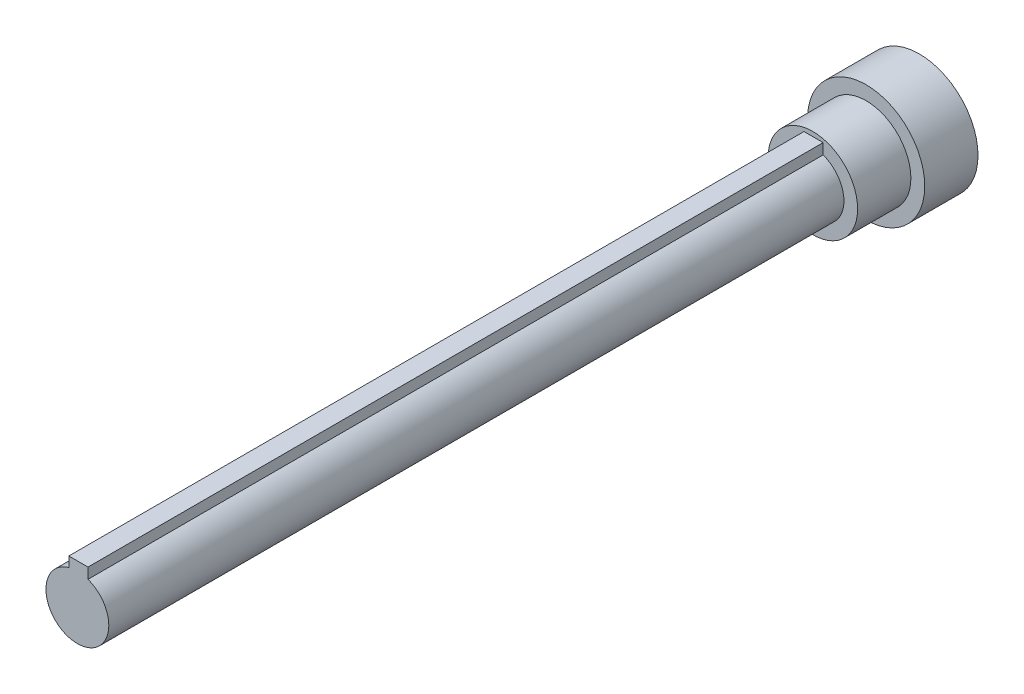
ISO-10303-21;
HEADER;
FILE_DESCRIPTION(('STEP AP214'),'2;1');
FILE_NAME('part.step','',(''),(''),'','','');
FILE_SCHEMA(('AUTOMOTIVE_DESIGN { 1 0 10303 214 1 1 1 1 }'));
ENDSEC;
DATA;
#1=APPLICATION_CONTEXT('core data for automotive mechanical design processes');
#2=APPLICATION_PROTOCOL_DEFINITION('international standard','automotive_design',2000,#1);
#3=PRODUCT_CONTEXT('',#1,'mechanical');
#4=PRODUCT('Part','Part','',(#3));
#5=PRODUCT_RELATED_PRODUCT_CATEGORY('part','',(#4));
#6=PRODUCT_DEFINITION_FORMATION('','',#4);
#7=PRODUCT_DEFINITION_CONTEXT('part definition',#1,'design');
#8=PRODUCT_DEFINITION('design','',#6,#7);
#9=PRODUCT_DEFINITION_SHAPE('','',#8);
#10=(LENGTH_UNIT() NAMED_UNIT(*) SI_UNIT(.MILLI.,.METRE.));
#11=(NAMED_UNIT(*) PLANE_ANGLE_UNIT() SI_UNIT($,.RADIAN.));
#12=(NAMED_UNIT(*) SI_UNIT($,.STERADIAN.) SOLID_ANGLE_UNIT());
#13=UNCERTAINTY_MEASURE_WITH_UNIT(LENGTH_MEASURE(1.E-05),#10,'distance_accuracy_value','');
#14=(GEOMETRIC_REPRESENTATION_CONTEXT(3) GLOBAL_UNCERTAINTY_ASSIGNED_CONTEXT((#13)) GLOBAL_UNIT_ASSIGNED_CONTEXT((#10,
#11,#12)) REPRESENTATION_CONTEXT('',''));
#15=CARTESIAN_POINT('',(0.,0.,0.));
#16=DIRECTION('',(0.,0.,1.));
#17=DIRECTION('',(1.,0.,0.));
#18=AXIS2_PLACEMENT_3D('',#15,#16,#17);
#19=CARTESIAN_POINT('',(0.,0.,5.));
#20=DIRECTION('',(0.,0.,-1.));
#21=DIRECTION('',(-1.,0.,0.));
#22=AXIS2_PLACEMENT_3D('',#19,#20,#21);
#23=CYLINDRICAL_SURFACE('',#22,5.5);
#24=CARTESIAN_POINT('',(0.,0.,5.));
#25=DIRECTION('',(0.,0.,1.));
#26=DIRECTION('',(1.,0.,0.));
#27=AXIS2_PLACEMENT_3D('',#24,#25,#26);
#28=CIRCLE('',#27,5.5);
#29=CARTESIAN_POINT('',(5.5,0.,5.));
#30=VERTEX_POINT('',#29);
#31=EDGE_CURVE('E56',#30,#30,#28,.T.);
#32=ORIENTED_EDGE('',*,*,#31,.F.);
#33=EDGE_LOOP('',(#32));
#34=FACE_BOUND('',#33,.T.);
#35=CARTESIAN_POINT('',(0.,0.,0.));
#36=DIRECTION('',(0.,0.,1.));
#37=DIRECTION('',(1.,0.,0.));
#38=AXIS2_PLACEMENT_3D('',#35,#36,#37);
#39=CIRCLE('',#38,5.5);
#40=CARTESIAN_POINT('',(5.5,0.,0.));
#41=VERTEX_POINT('',#40);
#42=EDGE_CURVE('E50',#41,#41,#39,.T.);
#43=ORIENTED_EDGE('',*,*,#42,.T.);
#44=EDGE_LOOP('',(#43));
#45=FACE_BOUND('',#44,.T.);
#46=ADVANCED_FACE('F47',(#34,#45),#23,.T.);
#47=CARTESIAN_POINT('',(0.,0.,5.));
#48=DIRECTION('',(0.,0.,1.));
#49=DIRECTION('',(1.,0.,0.));
#50=AXIS2_PLACEMENT_3D('',#47,#48,#49);
#51=PLANE('',#50);
#52=CARTESIAN_POINT('',(0.,0.,5.));
#53=DIRECTION('',(0.,0.,1.));
#54=DIRECTION('',(1.,0.,0.));
#55=AXIS2_PLACEMENT_3D('',#52,#53,#54);
#56=CIRCLE('',#55,4.2);
#57=CARTESIAN_POINT('',(4.2,0.,5.));
#58=VERTEX_POINT('',#57);
#59=EDGE_CURVE('E11',#58,#58,#56,.T.);
#60=ORIENTED_EDGE('',*,*,#59,.F.);
#61=EDGE_LOOP('',(#60));
#62=FACE_BOUND('',#61,.T.);
#63=ORIENTED_EDGE('',*,*,#31,.T.);
#64=EDGE_LOOP('',(#63));
#65=FACE_BOUND('',#64,.T.);
#66=ADVANCED_FACE('F134',(#62,#65),#51,.T.);
#67=CARTESIAN_POINT('',(0.,0.,0.));
#68=DIRECTION('',(0.,0.,1.));
#69=DIRECTION('',(1.,0.,0.));
#70=AXIS2_PLACEMENT_3D('',#67,#68,#69);
#71=PLANE('',#70);
#72=ORIENTED_EDGE('',*,*,#42,.F.);
#73=EDGE_LOOP('',(#72));
#74=FACE_BOUND('',#73,.T.);
#75=ADVANCED_FACE('F131',(#74),#71,.F.);
#76=CARTESIAN_POINT('',(0.,0.,10.));
#77=DIRECTION('',(0.,0.,-1.));
#78=DIRECTION('',(-1.,0.,0.));
#79=AXIS2_PLACEMENT_3D('',#76,#77,#78);
#80=CYLINDRICAL_SURFACE('',#79,4.2);
#81=CARTESIAN_POINT('',(0.,0.,10.));
#82=DIRECTION('',(0.,0.,1.));
#83=DIRECTION('',(1.,0.,0.));
#84=AXIS2_PLACEMENT_3D('',#81,#82,#83);
#85=CIRCLE('',#84,4.2);
#86=CARTESIAN_POINT('',(4.2,0.,10.));
#87=VERTEX_POINT('',#86);
#88=EDGE_CURVE('E113',#87,#87,#85,.T.);
#89=ORIENTED_EDGE('',*,*,#88,.F.);
#90=EDGE_LOOP('',(#89));
#91=FACE_BOUND('',#90,.T.);
#92=ORIENTED_EDGE('',*,*,#59,.T.);
#93=EDGE_LOOP('',(#92));
#94=FACE_BOUND('',#93,.T.);
#95=ADVANCED_FACE('F133',(#91,#94),#80,.T.);
#96=CARTESIAN_POINT('',(0.,0.,10.));
#97=DIRECTION('',(0.,0.,1.));
#98=DIRECTION('',(1.,0.,0.));
#99=AXIS2_PLACEMENT_3D('',#96,#97,#98);
#100=PLANE('',#99);
#101=CARTESIAN_POINT('',(-0.0325449137602418,0.,10.));
#102=DIRECTION('',(0.,0.,1.));
#103=DIRECTION('',(1.,0.,0.));
#104=AXIS2_PLACEMENT_3D('',#101,#102,#103);
#105=CIRCLE('',#104,2.95);
#106=CARTESIAN_POINT('',(-0.834166666666668,2.8389967533034,10.));
#107=VERTEX_POINT('',#106);
#108=CARTESIAN_POINT('',(0.965833333333332,2.7759216263667,10.));
#109=VERTEX_POINT('',#108);
#110=EDGE_CURVE('E64',#107,#109,#105,.T.);
#111=ORIENTED_EDGE('',*,*,#110,.F.);
#112=DIRECTION('',(0.,-1.,0.));
#113=VECTOR('',#112,1.);
#114=CARTESIAN_POINT('',(-0.834166666666668,3.7759216263667,10.));
#115=LINE('',#114,#113);
#116=CARTESIAN_POINT('',(-0.834166666666668,3.7759216263667,10.));
#117=VERTEX_POINT('',#116);
#118=EDGE_CURVE('E68',#117,#107,#115,.T.);
#119=ORIENTED_EDGE('',*,*,#118,.F.);
#120=DIRECTION('',(-1.,0.,0.));
#121=VECTOR('',#120,1.);
#122=CARTESIAN_POINT('',(-0.834166666666668,3.7759216263667,10.));
#123=LINE('',#122,#121);
#124=CARTESIAN_POINT('',(0.965833333333332,3.7759216263667,10.));
#125=VERTEX_POINT('',#124);
#126=EDGE_CURVE('E224',#125,#117,#123,.T.);
#127=ORIENTED_EDGE('',*,*,#126,.F.);
#128=DIRECTION('',(0.,1.,0.));
#129=VECTOR('',#128,1.);
#130=CARTESIAN_POINT('',(0.965833333333332,3.7759216263667,10.));
#131=LINE('',#130,#129);
#132=EDGE_CURVE('E234',#109,#125,#131,.T.);
#133=ORIENTED_EDGE('',*,*,#132,.F.);
#134=EDGE_LOOP('',(#111,#119,#127,#133));
#135=FACE_BOUND('',#134,.T.);
#136=ORIENTED_EDGE('',*,*,#88,.T.);
#137=EDGE_LOOP('',(#136));
#138=FACE_BOUND('',#137,.T.);
#139=ADVANCED_FACE('F140',(#135,#138),#100,.T.);
#140=CARTESIAN_POINT('',(-0.0325449137602418,0.,79.));
#141=DIRECTION('',(0.,0.,-1.));
#142=DIRECTION('',(-1.,0.,0.));
#143=AXIS2_PLACEMENT_3D('',#140,#141,#142);
#144=CYLINDRICAL_SURFACE('',#143,2.95);
#145=ORIENTED_EDGE('',*,*,#110,.T.);
#146=DIRECTION('',(0.,0.,-1.));
#147=VECTOR('',#146,1.);
#148=CARTESIAN_POINT('',(0.965833333333332,2.7759216263667,79.));
#149=LINE('',#148,#147);
#150=CARTESIAN_POINT('',(0.965833333333332,2.7759216263667,79.));
#151=VERTEX_POINT('',#150);
#152=EDGE_CURVE('E93',#151,#109,#149,.T.);
#153=ORIENTED_EDGE('',*,*,#152,.F.);
#154=CARTESIAN_POINT('',(-0.0325449137602418,0.,79.));
#155=DIRECTION('',(0.,0.,1.));
#156=DIRECTION('',(1.,0.,0.));
#157=AXIS2_PLACEMENT_3D('',#154,#155,#156);
#158=CIRCLE('',#157,2.95);
#159=CARTESIAN_POINT('',(-0.834166666666668,2.8389967533034,79.));
#160=VERTEX_POINT('',#159);
#161=EDGE_CURVE('E100',#160,#151,#158,.T.);
#162=ORIENTED_EDGE('',*,*,#161,.F.);
#163=DIRECTION('',(0.,0.,-1.));
#164=VECTOR('',#163,1.);
#165=CARTESIAN_POINT('',(-0.834166666666668,2.8389967533034,79.));
#166=LINE('',#165,#164);
#167=EDGE_CURVE('E221',#160,#107,#166,.T.);
#168=ORIENTED_EDGE('',*,*,#167,.T.);
#169=EDGE_LOOP('',(#145,#153,#162,#168));
#170=FACE_BOUND('',#169,.T.);
#171=ADVANCED_FACE('F111',(#170),#144,.T.);
#172=CARTESIAN_POINT('',(0.965833333333332,3.7759216263667,79.));
#173=DIRECTION('',(-1.,0.,0.));
#174=DIRECTION('',(0.,-1.,0.));
#175=AXIS2_PLACEMENT_3D('',#172,#173,#174);
#176=PLANE('',#175);
#177=ORIENTED_EDGE('',*,*,#132,.T.);
#178=DIRECTION('',(0.,0.,-1.));
#179=VECTOR('',#178,1.);
#180=CARTESIAN_POINT('',(0.965833333333332,3.7759216263667,79.));
#181=LINE('',#180,#179);
#182=CARTESIAN_POINT('',(0.965833333333332,3.7759216263667,79.));
#183=VERTEX_POINT('',#182);
#184=EDGE_CURVE('E95',#183,#125,#181,.T.);
#185=ORIENTED_EDGE('',*,*,#184,.F.);
#186=DIRECTION('',(0.,1.,0.));
#187=VECTOR('',#186,1.);
#188=CARTESIAN_POINT('',(0.965833333333332,3.7759216263667,79.));
#189=LINE('',#188,#187);
#190=EDGE_CURVE('E88',#151,#183,#189,.T.);
#191=ORIENTED_EDGE('',*,*,#190,.F.);
#192=ORIENTED_EDGE('',*,*,#152,.T.);
#193=EDGE_LOOP('',(#177,#185,#191,#192));
#194=FACE_BOUND('',#193,.T.);
#195=ADVANCED_FACE('F91',(#194),#176,.F.);
#196=CARTESIAN_POINT('',(-0.834166666666668,3.7759216263667,79.));
#197=DIRECTION('',(0.,-1.,0.));
#198=DIRECTION('',(0.,0.,-1.));
#199=AXIS2_PLACEMENT_3D('',#196,#197,#198);
#200=PLANE('',#199);
#201=ORIENTED_EDGE('',*,*,#126,.T.);
#202=DIRECTION('',(0.,0.,-1.));
#203=VECTOR('',#202,1.);
#204=CARTESIAN_POINT('',(-0.834166666666668,3.7759216263667,79.));
#205=LINE('',#204,#203);
#206=CARTESIAN_POINT('',(-0.834166666666668,3.7759216263667,79.));
#207=VERTEX_POINT('',#206);
#208=EDGE_CURVE('E119',#207,#117,#205,.T.);
#209=ORIENTED_EDGE('',*,*,#208,.F.);
#210=DIRECTION('',(-1.,0.,0.));
#211=VECTOR('',#210,1.);
#212=CARTESIAN_POINT('',(-0.834166666666668,3.7759216263667,79.));
#213=LINE('',#212,#211);
#214=EDGE_CURVE('E99',#183,#207,#213,.T.);
#215=ORIENTED_EDGE('',*,*,#214,.F.);
#216=ORIENTED_EDGE('',*,*,#184,.T.);
#217=EDGE_LOOP('',(#201,#209,#215,#216));
#218=FACE_BOUND('',#217,.T.);
#219=ADVANCED_FACE('F190',(#218),#200,.F.);
#220=CARTESIAN_POINT('',(-0.834166666666668,3.7759216263667,79.));
#221=DIRECTION('',(1.,0.,0.));
#222=DIRECTION('',(0.,0.,-1.));
#223=AXIS2_PLACEMENT_3D('',#220,#221,#222);
#224=PLANE('',#223);
#225=ORIENTED_EDGE('',*,*,#118,.T.);
#226=ORIENTED_EDGE('',*,*,#167,.F.);
#227=DIRECTION('',(0.,-1.,0.));
#228=VECTOR('',#227,1.);
#229=CARTESIAN_POINT('',(-0.834166666666668,3.7759216263667,79.));
#230=LINE('',#229,#228);
#231=EDGE_CURVE('E105',#207,#160,#230,.T.);
#232=ORIENTED_EDGE('',*,*,#231,.F.);
#233=ORIENTED_EDGE('',*,*,#208,.T.);
#234=EDGE_LOOP('',(#225,#226,#232,#233));
#235=FACE_BOUND('',#234,.T.);
#236=ADVANCED_FACE('F199',(#235),#224,.F.);
#237=CARTESIAN_POINT('',(-0.0325449137602418,0.,79.));
#238=DIRECTION('',(0.,0.,1.));
#239=DIRECTION('',(1.,0.,0.));
#240=AXIS2_PLACEMENT_3D('',#237,#238,#239);
#241=PLANE('',#240);
#242=ORIENTED_EDGE('',*,*,#161,.T.);
#243=ORIENTED_EDGE('',*,*,#190,.T.);
#244=ORIENTED_EDGE('',*,*,#214,.T.);
#245=ORIENTED_EDGE('',*,*,#231,.T.);
#246=EDGE_LOOP('',(#242,#243,#244,#245));
#247=FACE_BOUND('',#246,.T.);
#248=ADVANCED_FACE('F103',(#247),#241,.T.);
#249=CLOSED_SHELL('',(#46,#66,#75,#95,#139,#171,#195,#219,#236,#248));
#250=MANIFOLD_SOLID_BREP('B2',#249);
#251=ADVANCED_BREP_SHAPE_REPRESENTATION('',(#18,#250),#14);
#252=SHAPE_DEFINITION_REPRESENTATION(#9,#251);
ENDSEC;
END-ISO-10303-21;
